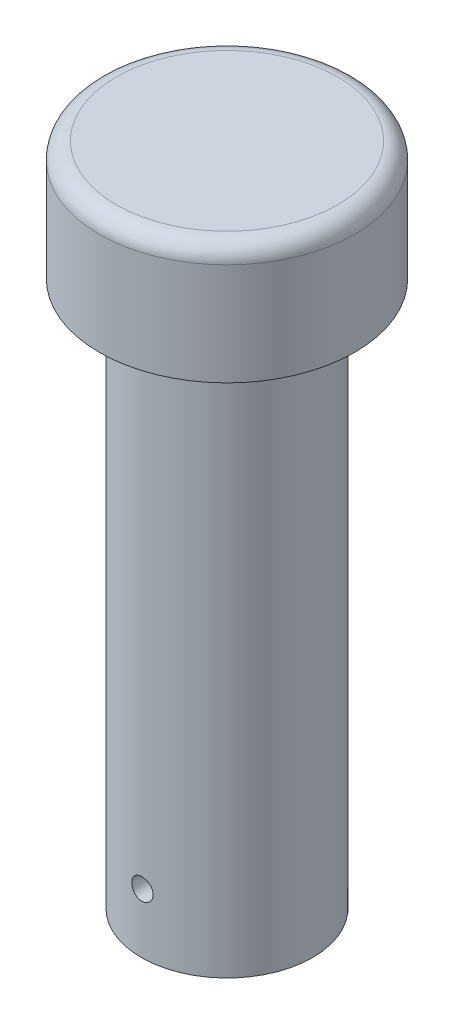
ISO-10303-21;
HEADER;
FILE_DESCRIPTION(('STEP AP214'),'2;1');
FILE_NAME('part.step','',(''),(''),'','','');
FILE_SCHEMA(('AUTOMOTIVE_DESIGN { 1 0 10303 214 1 1 1 1 }'));
ENDSEC;
DATA;
#1=APPLICATION_CONTEXT('core data for automotive mechanical design processes');
#2=APPLICATION_PROTOCOL_DEFINITION('international standard','automotive_design',2000,#1);
#3=PRODUCT_CONTEXT('',#1,'mechanical');
#4=PRODUCT('Part','Part','',(#3));
#5=PRODUCT_RELATED_PRODUCT_CATEGORY('part','',(#4));
#6=PRODUCT_DEFINITION_FORMATION('','',#4);
#7=PRODUCT_DEFINITION_CONTEXT('part definition',#1,'design');
#8=PRODUCT_DEFINITION('design','',#6,#7);
#9=PRODUCT_DEFINITION_SHAPE('','',#8);
#10=(LENGTH_UNIT() NAMED_UNIT(*) SI_UNIT(.MILLI.,.METRE.));
#11=(NAMED_UNIT(*) PLANE_ANGLE_UNIT() SI_UNIT($,.RADIAN.));
#12=(NAMED_UNIT(*) SI_UNIT($,.STERADIAN.) SOLID_ANGLE_UNIT());
#13=UNCERTAINTY_MEASURE_WITH_UNIT(LENGTH_MEASURE(1.E-05),#10,'distance_accuracy_value','');
#14=(GEOMETRIC_REPRESENTATION_CONTEXT(3) GLOBAL_UNCERTAINTY_ASSIGNED_CONTEXT((#13)) GLOBAL_UNIT_ASSIGNED_CONTEXT((#10,
#11,#12)) REPRESENTATION_CONTEXT('',''));
#15=CARTESIAN_POINT('',(0.,0.,0.));
#16=DIRECTION('',(0.,0.,1.));
#17=DIRECTION('',(1.,0.,0.));
#18=AXIS2_PLACEMENT_3D('',#15,#16,#17);
#19=CARTESIAN_POINT('',(0.,0.,0.));
#20=DIRECTION('',(0.,-1.,0.));
#21=DIRECTION('',(1.,0.,0.));
#22=AXIS2_PLACEMENT_3D('',#19,#20,#21);
#23=CYLINDRICAL_SURFACE('',#22,10.0490310034832);
#24=CARTESIAN_POINT('',(0.,0.,0.));
#25=DIRECTION('',(0.,-1.,0.));
#26=DIRECTION('',(1.,0.,0.));
#27=AXIS2_PLACEMENT_3D('',#24,#25,#26);
#28=CIRCLE('',#27,10.0490310034832);
#29=CARTESIAN_POINT('',(10.0490310034833,0.,0.));
#30=VERTEX_POINT('',#29);
#31=EDGE_CURVE('E71',#30,#30,#28,.T.);
#32=ORIENTED_EDGE('',*,*,#31,.F.);
#33=EDGE_LOOP('',(#32));
#34=FACE_BOUND('',#33,.T.);
#35=CARTESIAN_POINT('',(0.,64.,0.));
#36=DIRECTION('',(0.,-1.,0.));
#37=DIRECTION('',(1.,0.,0.));
#38=AXIS2_PLACEMENT_3D('',#35,#36,#37);
#39=CIRCLE('',#38,10.0490310034832);
#40=CARTESIAN_POINT('',(10.0490310034833,64.,0.));
#41=VERTEX_POINT('',#40);
#42=EDGE_CURVE('E112',#41,#41,#39,.T.);
#43=ORIENTED_EDGE('',*,*,#42,.T.);
#44=EDGE_LOOP('',(#43));
#45=FACE_BOUND('',#44,.T.);
#46=CARTESIAN_POINT('',(-1.20096899651696,7.00000000000001,-9.97700844834584));
#47=CARTESIAN_POINT('',(-1.20096602661466,7.06994777047504,-9.97700943290286));
#48=CARTESIAN_POINT('',(-1.19507802089044,7.13993930959228,-9.97772302440675));
#49=CARTESIAN_POINT('',(-1.17168191921586,7.27797549624546,-9.98049693275863));
#50=CARTESIAN_POINT('',(-1.15416166700574,7.34601802929543,-9.98255865843786));
#51=CARTESIAN_POINT('',(-1.10802336863928,7.47813844991756,-9.98778473632166));
#52=CARTESIAN_POINT('',(-1.07941263875882,7.54221891897629,-9.99094836147498));
#53=CARTESIAN_POINT('',(-1.01192016876901,7.66465735722281,-9.99800917829101));
#54=CARTESIAN_POINT('',(-0.973040214008706,7.72301631870349,-10.0019062424084));
#55=CARTESIAN_POINT('',(-0.885897088444158,7.83266803343691,-10.0100014260444));
#56=CARTESIAN_POINT('',(-0.837591548068009,7.88392702242294,-10.0142008488221));
#57=CARTESIAN_POINT('',(-0.733058930355346,7.97763109945409,-10.0223945085178));
#58=CARTESIAN_POINT('',(-0.676831484390437,8.02007577711717,-10.0263887358756));
#59=CARTESIAN_POINT('',(-0.557856950722236,8.09505454857212,-10.0337119842322));
#60=CARTESIAN_POINT('',(-0.495092313491918,8.12756099256419,-10.0370391406464));
#61=CARTESIAN_POINT('',(-0.364946921397817,8.18156048765048,-10.0426129716716));
#62=CARTESIAN_POINT('',(-0.297566341022408,8.20305395478874,-10.0448596870988));
#63=CARTESIAN_POINT('',(-0.160479323844041,8.23431027622814,-10.0479820919894));
#64=CARTESIAN_POINT('',(-0.0907869820064461,8.24413422637568,-10.0488649294235));
#65=CARTESIAN_POINT('',(0.0492600957614257,8.25196571972337,-10.0491541757943));
#66=CARTESIAN_POINT('',(0.119614807458572,8.24997369355249,-10.0485606385374));
#67=CARTESIAN_POINT('',(0.258612809320182,8.23427817663848,-10.0459421025385));
#68=CARTESIAN_POINT('',(0.327262985257314,8.22063431814498,-10.0439244015494));
#69=CARTESIAN_POINT('',(0.461287917617957,8.18211932812042,-10.0386621826073));
#70=CARTESIAN_POINT('',(0.526662601466092,8.15724794794225,-10.0354176374846));
#71=CARTESIAN_POINT('',(0.652519463261043,8.09689922372657,-10.0280224006302));
#72=CARTESIAN_POINT('',(0.712985299435614,8.0613881631936,-10.0238688397334));
#73=CARTESIAN_POINT('',(0.827122618755533,7.98079292328371,-10.0150973022249));
#74=CARTESIAN_POINT('',(0.880793782959897,7.93570829479055,-10.0104793038307));
#75=CARTESIAN_POINT('',(0.980207303259671,7.83687344723716,-10.0012365543212));
#76=CARTESIAN_POINT('',(1.02589227114185,7.78306546691293,-9.99661197729174));
#77=CARTESIAN_POINT('',(1.10758900054958,7.66850899441756,-9.98789087125032));
#78=CARTESIAN_POINT('',(1.14360075230733,7.60776049523812,-9.98379434277154));
#79=CARTESIAN_POINT('',(1.20491715526069,7.48102242134106,-9.97658040506178));
#80=CARTESIAN_POINT('',(1.23022153950048,7.41503271599854,-9.97346302024327));
#81=CARTESIAN_POINT('',(1.26937302783663,7.27969123028548,-9.96855602105133));
#82=CARTESIAN_POINT('',(1.28322072314337,7.21033962359787,-9.96676633816374));
#83=CARTESIAN_POINT('',(1.29898517912394,7.07078199871088,-9.96472405021067));
#84=CARTESIAN_POINT('',(1.30098780640956,7.00058583538987,-9.96446038313645));
#85=CARTESIAN_POINT('',(1.29323173743294,6.86085893697435,-9.965469907875));
#86=CARTESIAN_POINT('',(1.28347330841755,6.79132818679582,-9.96674306476648));
#87=CARTESIAN_POINT('',(1.2525431064141,6.65515725708869,-9.97067695900321));
#88=CARTESIAN_POINT('',(1.23141194063645,6.58850769921412,-9.97333275842384));
#89=CARTESIAN_POINT('',(1.17837839990771,6.45969814669192,-9.97973735513003));
#90=CARTESIAN_POINT('',(1.14647563251258,6.39753831571964,-9.98348619223779));
#91=CARTESIAN_POINT('',(1.07259808714457,6.27909118971406,-9.99169361289866));
#92=CARTESIAN_POINT('',(1.03056807566541,6.2228386157773,-9.9961560418319));
#93=CARTESIAN_POINT('',(0.937708288920097,6.11815618333013,-10.0052935204144));
#94=CARTESIAN_POINT('',(0.8868781438223,6.06972665375392,-10.0099685789935));
#95=CARTESIAN_POINT('',(0.777482049760646,5.98175848214614,-10.019060394613));
#96=CARTESIAN_POINT('',(0.718869917269498,5.94227705968786,-10.0234753626608));
#97=CARTESIAN_POINT('',(0.595798134518134,5.87371979660667,-10.0315425717925));
#98=CARTESIAN_POINT('',(0.531338588128609,5.84464377119256,-10.0351948264211));
#99=CARTESIAN_POINT('',(0.398553223849828,5.7978025804185,-10.0413436625032));
#100=CARTESIAN_POINT('',(0.330237041247274,5.78001047674363,-10.0438429924324));
#101=CARTESIAN_POINT('',(0.19155116718208,5.75615996213784,-10.0474445099136));
#102=CARTESIAN_POINT('',(0.121181570534403,5.7501010103043,-10.0485467618706));
#103=CARTESIAN_POINT('',(-0.0190856960246203,5.74990219602383,-10.0492559315308));
#104=CARTESIAN_POINT('',(-0.0889832080665156,5.75567889248741,-10.0488733006233));
#105=CARTESIAN_POINT('',(-0.226810884618131,5.77881443974995,-10.0467075699833));
#106=CARTESIAN_POINT('',(-0.294741056887878,5.79617324485765,-10.0449244757756));
#107=CARTESIAN_POINT('',(-0.426654340961013,5.84194412362637,-10.0401865548437));
#108=CARTESIAN_POINT('',(-0.490640960911992,5.87034620393601,-10.0372327874462));
#109=CARTESIAN_POINT('',(-0.612954145199407,5.93739008414521,-10.0305068530772));
#110=CARTESIAN_POINT('',(-0.671280658647044,5.97603197609706,-10.0267346787487));
#111=CARTESIAN_POINT('',(-0.781006459666883,6.06273938467569,-10.0187874830819));
#112=CARTESIAN_POINT('',(-0.832360912447587,6.11086142584252,-10.0146101256813));
#113=CARTESIAN_POINT('',(-0.926298634227643,6.21504626121868,-10.0063592074469));
#114=CARTESIAN_POINT('',(-0.968879817374801,6.27111093846184,-10.0022856714979));
#115=CARTESIAN_POINT('',(-1.04421043940365,6.38984604047404,-9.99470320469237));
#116=CARTESIAN_POINT('',(-1.07691962941726,6.45254213678013,-9.9911966115581));
#117=CARTESIAN_POINT('',(-1.13130077905499,6.58254261441208,-9.98518592103724));
#118=CARTESIAN_POINT('',(-1.15298469954334,6.64984191156844,-9.98268073789571));
#119=CARTESIAN_POINT('',(-1.17951279567661,6.76457380151842,-9.97957327603358));
#120=CARTESIAN_POINT('',(-1.18754735420265,6.81128429879012,-9.97861638317947));
#121=CARTESIAN_POINT('',(-1.19827644135072,6.90532318182883,-9.97733363828725));
#122=CARTESIAN_POINT('',(-1.20097100687741,6.95265156332336,-9.97700778188806));
#123=CARTESIAN_POINT('',(-1.20096899651696,7.00000000000001,-9.97700844834584));
#124=B_SPLINE_CURVE_WITH_KNOTS('',3,(#46,#47,#48,#49,#50,#51,#52,#53,#54,#55,#56,#57,#58,#59,
#60,#61,#62,#63,#64,#65,#66,#67,#68,#69,#70,#71,#72,#73,#74,#75,#76,#77,#78,#79,#80,#81,#82,#83,
#84,#85,#86,#87,#88,#89,#90,#91,#92,#93,#94,#95,#96,#97,#98,#99,#100,#101,#102,#103,#104,#105,
#106,#107,#108,#109,#110,#111,#112,#113,#114,#115,#116,#117,#118,#119,#120,#121,#122,#123),
.UNSPECIFIED.,.T.,.F.,(4,2,2,2,2,2,2,2,2,2,2,2,2,2,2,2,2,2,2,2,2,2,2,2,2,2,2,2,2,2,2,2,2,2,2,2,
2,2,4),(0.,0.209670413164504,0.419560287666007,0.629311934937426,0.839027139955425,
1.04970771986977,1.26039810657987,1.47166944344655,1.68293279839688,1.89308513772612,
2.10322981817645,2.31230541237919,2.52138563704207,2.73113556075312,2.94089532644952,
3.15210543817618,3.36331576317737,3.57453135375878,3.78573604410189,3.99540778622591,
4.20507476406223,4.41399802927191,4.62292890704834,4.83302615725208,5.04313223908086,
5.25454616761637,5.46595634143011,5.67685989293033,5.88775372146789,6.09716586938782,
6.30657719118451,6.51579945054036,6.72502359079424,6.93553517922943,7.14609675936418,
7.35750556541796,7.56868453071477,7.71061378483293,7.85254205807544),.UNSPECIFIED.);
#125=CARTESIAN_POINT('',(-1.20096899651696,7.00000000000001,-9.97700844834584));
#126=VERTEX_POINT('',#125);
#127=EDGE_CURVE('E74',#126,#126,#124,.T.);
#128=ORIENTED_EDGE('',*,*,#127,.F.);
#129=EDGE_LOOP('',(#128));
#130=FACE_BOUND('',#129,.T.);
#131=CARTESIAN_POINT('',(-1.2009689965168,7.00000000000001,9.97700844834629));
#132=CARTESIAN_POINT('',(-1.20096602661445,6.93005222952495,9.9770094329034));
#133=CARTESIAN_POINT('',(-1.19507802089036,6.8600606904077,9.97772302440682));
#134=CARTESIAN_POINT('',(-1.17168191921592,6.72202450375451,9.98049693275856));
#135=CARTESIAN_POINT('',(-1.15416166700582,6.65398197070455,9.9825586584381));
#136=CARTESIAN_POINT('',(-1.10802336863933,6.52186155008243,9.98778473632192));
#137=CARTESIAN_POINT('',(-1.07941263875883,6.45778108102371,9.99094836147495));
#138=CARTESIAN_POINT('',(-1.01192016876899,6.3353426427772,9.99800917829104));
#139=CARTESIAN_POINT('',(-0.973040214008698,6.27698368129653,10.0019062424088));
#140=CARTESIAN_POINT('',(-0.885897088444146,6.16733196656311,10.0100014260447));
#141=CARTESIAN_POINT('',(-0.837591548067983,6.11607297757706,10.0142008488221));
#142=CARTESIAN_POINT('',(-0.733058930355338,6.0223689005459,10.0223945085178));
#143=CARTESIAN_POINT('',(-0.676831484390462,5.97992422288283,10.026388735876));
#144=CARTESIAN_POINT('',(-0.557856950722269,5.9049454514279,10.0337119842327));
#145=CARTESIAN_POINT('',(-0.495092313491925,5.87243900743582,10.0370391406465));
#146=CARTESIAN_POINT('',(-0.3649469213978,5.81843951234953,10.0426129716715));
#147=CARTESIAN_POINT('',(-0.297566341022393,5.79694604521127,10.044859687099));
#148=CARTESIAN_POINT('',(-0.160479323844027,5.76568972377188,10.0479820919896));
#149=CARTESIAN_POINT('',(-0.0907869820064323,5.75586577362433,10.0488649294236));
#150=CARTESIAN_POINT('',(0.0492600957614322,5.74803428027665,10.0491541757942));
#151=CARTESIAN_POINT('',(0.119614807458572,5.75002630644752,10.0485606385374));
#152=CARTESIAN_POINT('',(0.258612809320167,5.76572182336153,10.0459421025385));
#153=CARTESIAN_POINT('',(0.327262985257292,5.77936568185503,10.0439244015494));
#154=CARTESIAN_POINT('',(0.461287917617927,5.81788067187958,10.0386621826073));
#155=CARTESIAN_POINT('',(0.526662601466062,5.84275205205773,10.0354176374846));
#156=CARTESIAN_POINT('',(0.652519463261018,5.90310077627342,10.0280224006302));
#157=CARTESIAN_POINT('',(0.712985299435594,5.9386118368064,10.0238688397334));
#158=CARTESIAN_POINT('',(0.827122618755534,6.0192070767163,10.0150973022249));
#159=CARTESIAN_POINT('',(0.880793782959916,6.06429170520946,10.0104793038307));
#160=CARTESIAN_POINT('',(0.980207303259692,6.16312655276285,10.0012365543212));
#161=CARTESIAN_POINT('',(1.02589227114186,6.21693453308707,9.9966119772917));
#162=CARTESIAN_POINT('',(1.10758900054955,6.33149100558245,9.98789087125037));
#163=CARTESIAN_POINT('',(1.14360075230729,6.3922395047619,9.98379434277174));
#164=CARTESIAN_POINT('',(1.20491715526065,6.51897757865896,9.97658040506196));
#165=CARTESIAN_POINT('',(1.23022153950046,6.58496728400147,9.97346302024329));
#166=CARTESIAN_POINT('',(1.26937302783665,6.72030876971452,9.96855602105131));
#167=CARTESIAN_POINT('',(1.28322072314341,6.78966037640214,9.96676633816384));
#168=CARTESIAN_POINT('',(1.29898517912397,6.92921800128913,9.96472405021079));
#169=CARTESIAN_POINT('',(1.30098780640957,6.99941416461013,9.96446038313647));
#170=CARTESIAN_POINT('',(1.29323173743293,7.13914106302564,9.96546990787499));
#171=CARTESIAN_POINT('',(1.28347330841754,7.20867181320416,9.96674306476653));
#172=CARTESIAN_POINT('',(1.2525431064141,7.3448427429113,9.97067695900327));
#173=CARTESIAN_POINT('',(1.23141194063646,7.41149230078587,9.97333275842382));
#174=CARTESIAN_POINT('',(1.17837839990772,7.54030185330807,9.97973735513005));
#175=CARTESIAN_POINT('',(1.1464756325126,7.60246168428034,9.98348619223791));
#176=CARTESIAN_POINT('',(1.07259808714459,7.72090881028592,9.99169361289877));
#177=CARTESIAN_POINT('',(1.03056807566542,7.77716138422269,9.9961560418319));
#178=CARTESIAN_POINT('',(0.937708288920113,7.88184381666988,10.0052935204144));
#179=CARTESIAN_POINT('',(0.886878143822328,7.93027334624609,10.0099685789936));
#180=CARTESIAN_POINT('',(0.777482049760674,8.01824151785387,10.0190603946131));
#181=CARTESIAN_POINT('',(0.718869917269514,8.05772294031214,10.0234753626608));
#182=CARTESIAN_POINT('',(0.595798134518143,8.12628020339334,10.0315425717925));
#183=CARTESIAN_POINT('',(0.531338588128623,8.15535622880745,10.0351948264212));
#184=CARTESIAN_POINT('',(0.398553223849846,8.20219741958151,10.0413436625033));
#185=CARTESIAN_POINT('',(0.33023704124729,8.21998952325638,10.0438429924324));
#186=CARTESIAN_POINT('',(0.191551167182099,8.24384003786217,10.0474445099137));
#187=CARTESIAN_POINT('',(0.121181570534427,8.24989898969571,10.0485467618708));
#188=CARTESIAN_POINT('',(-0.0190856960245974,8.25009780397619,10.049255931531));
#189=CARTESIAN_POINT('',(-0.088983208066498,8.24432110751261,10.0488733006233));
#190=CARTESIAN_POINT('',(-0.22681088461813,8.22118556025006,10.0467075699833));
#191=CARTESIAN_POINT('',(-0.294741056887888,8.20382675514235,10.0449244757759));
#192=CARTESIAN_POINT('',(-0.426654340961012,8.15805587637365,10.0401865548439));
#193=CARTESIAN_POINT('',(-0.490640960911969,8.12965379606404,10.037232787446));
#194=CARTESIAN_POINT('',(-0.612954145199358,8.06260991585481,10.0305068530774));
#195=CARTESIAN_POINT('',(-0.671280658646991,8.02396802390291,10.0267346787496));
#196=CARTESIAN_POINT('',(-0.781006459666832,7.93726061532429,10.0187874830827));
#197=CARTESIAN_POINT('',(-0.832360912447539,7.88913857415751,10.0146101256814));
#198=CARTESIAN_POINT('',(-0.926298634227645,7.78495373878137,10.0063592074467));
#199=CARTESIAN_POINT('',(-0.968879817374849,7.72888906153819,10.0022856714983));
#200=CARTESIAN_POINT('',(-1.04421043940371,7.61015395952597,9.99470320469285));
#201=CARTESIAN_POINT('',(-1.07691962941727,7.54745786321988,9.99119661155816));
#202=CARTESIAN_POINT('',(-1.13130077905497,7.41745738558793,9.98518592103718));
#203=CARTESIAN_POINT('',(-1.15298469954333,7.35015808843157,9.98268073789596));
#204=CARTESIAN_POINT('',(-1.17951279567663,7.2354261984816,9.97957327603374));
#205=CARTESIAN_POINT('',(-1.18754735420269,7.1887157012099,9.97861638317941));
#206=CARTESIAN_POINT('',(-1.19827644135068,7.0946768181712,9.97733363828731));
#207=CARTESIAN_POINT('',(-1.20097100687727,7.04734843667666,9.97700778188844));
#208=CARTESIAN_POINT('',(-1.2009689965168,7.00000000000001,9.97700844834629));
#209=B_SPLINE_CURVE_WITH_KNOTS('',3,(#131,#132,#133,#134,#135,#136,#137,#138,#139,#140,#141,
#142,#143,#144,#145,#146,#147,#148,#149,#150,#151,#152,#153,#154,#155,#156,#157,#158,#159,#160,
#161,#162,#163,#164,#165,#166,#167,#168,#169,#170,#171,#172,#173,#174,#175,#176,#177,#178,#179,
#180,#181,#182,#183,#184,#185,#186,#187,#188,#189,#190,#191,#192,#193,#194,#195,#196,#197,#198,
#199,#200,#201,#202,#203,#204,#205,#206,#207,#208),.UNSPECIFIED.,.T.,.F.,(4,2,2,2,2,2,2,2,2,2,2,
2,2,2,2,2,2,2,2,2,2,2,2,2,2,2,2,2,2,2,2,2,2,2,2,2,2,2,4),(0.,0.209670413164528,
0.419560287666007,0.629311934937417,0.839027139955443,1.04970771986978,1.26039810657985,
1.47166944344655,1.6829327983969,1.89308513772613,2.10322981817644,2.31230541237916,
2.52138563704202,2.73113556075311,2.94089532644954,3.15210543817617,3.36331576317734,
3.57453135375877,3.78573604410188,3.99540778622589,4.2050747640622,4.41399802927188,
4.62292890704831,4.83302615725205,5.04313223908084,5.25454616761635,5.4659563414301,
5.67685989293031,5.88775372146787,6.09716586938782,6.30657719118452,6.51579945054032,
6.72502359079416,6.93553517922939,7.14609675936419,7.35750556541797,7.56868453071477,
7.71061378483291,7.85254205807543),.UNSPECIFIED.);
#210=CARTESIAN_POINT('',(-1.2009689965168,7.00000000000001,9.97700844834629));
#211=VERTEX_POINT('',#210);
#212=EDGE_CURVE('E57',#211,#211,#209,.T.);
#213=ORIENTED_EDGE('',*,*,#212,.F.);
#214=EDGE_LOOP('',(#213));
#215=FACE_BOUND('',#214,.T.);
#216=ADVANCED_FACE('F53',(#34,#45,#130,#215),#23,.T.);
#217=CARTESIAN_POINT('',(0.,78.,0.));
#218=DIRECTION('',(0.,-1.,0.));
#219=DIRECTION('',(1.,0.,0.));
#220=AXIS2_PLACEMENT_3D('',#217,#218,#219);
#221=PLANE('',#220);
#222=CARTESIAN_POINT('',(0.,78.,0.));
#223=DIRECTION('',(0.,-1.,0.));
#224=DIRECTION('',(1.,0.,0.));
#225=AXIS2_PLACEMENT_3D('',#222,#223,#224);
#226=CIRCLE('',#225,13.);
#227=CARTESIAN_POINT('',(13.0000000000001,78.,0.));
#228=VERTEX_POINT('',#227);
#229=EDGE_CURVE('E12',#228,#228,#226,.F.);
#230=ORIENTED_EDGE('',*,*,#229,.T.);
#231=EDGE_LOOP('',(#230));
#232=FACE_BOUND('',#231,.T.);
#233=ADVANCED_FACE('F86',(#232),#221,.F.);
#234=CARTESIAN_POINT('',(0.,0.,0.));
#235=DIRECTION('',(0.,-1.,0.));
#236=DIRECTION('',(1.,0.,0.));
#237=AXIS2_PLACEMENT_3D('',#234,#235,#236);
#238=CYLINDRICAL_SURFACE('',#237,15.);
#239=CARTESIAN_POINT('',(0.,76.,0.));
#240=DIRECTION('',(0.,-1.,0.));
#241=DIRECTION('',(1.,0.,0.));
#242=AXIS2_PLACEMENT_3D('',#239,#240,#241);
#243=CIRCLE('',#242,15.);
#244=CARTESIAN_POINT('',(15.0000000000001,76.,0.));
#245=VERTEX_POINT('',#244);
#246=EDGE_CURVE('E66',#245,#245,#243,.T.);
#247=ORIENTED_EDGE('',*,*,#246,.T.);
#248=EDGE_LOOP('',(#247));
#249=FACE_BOUND('',#248,.T.);
#250=CARTESIAN_POINT('',(0.,64.,0.));
#251=DIRECTION('',(0.,-1.,0.));
#252=DIRECTION('',(1.,0.,0.));
#253=AXIS2_PLACEMENT_3D('',#250,#251,#252);
#254=CIRCLE('',#253,15.);
#255=CARTESIAN_POINT('',(15.0000000000001,64.,0.));
#256=VERTEX_POINT('',#255);
#257=EDGE_CURVE('E118',#256,#256,#254,.T.);
#258=ORIENTED_EDGE('',*,*,#257,.F.);
#259=EDGE_LOOP('',(#258));
#260=FACE_BOUND('',#259,.T.);
#261=ADVANCED_FACE('F90',(#249,#260),#238,.T.);
#262=CARTESIAN_POINT('',(0.,64.,0.));
#263=DIRECTION('',(0.,1.,0.));
#264=DIRECTION('',(-1.,0.,0.));
#265=AXIS2_PLACEMENT_3D('',#262,#263,#264);
#266=PLANE('',#265);
#267=ORIENTED_EDGE('',*,*,#42,.F.);
#268=EDGE_LOOP('',(#267));
#269=FACE_BOUND('',#268,.T.);
#270=ORIENTED_EDGE('',*,*,#257,.T.);
#271=EDGE_LOOP('',(#270));
#272=FACE_BOUND('',#271,.T.);
#273=ADVANCED_FACE('F91',(#269,#272),#266,.F.);
#274=CARTESIAN_POINT('',(0.,0.,0.));
#275=DIRECTION('',(0.,-1.,0.));
#276=DIRECTION('',(1.,0.,0.));
#277=AXIS2_PLACEMENT_3D('',#274,#275,#276);
#278=PLANE('',#277);
#279=ORIENTED_EDGE('',*,*,#31,.T.);
#280=EDGE_LOOP('',(#279));
#281=FACE_BOUND('',#280,.T.);
#282=ADVANCED_FACE('F95',(#281),#278,.T.);
#283=CARTESIAN_POINT('',(0.,76.,0.));
#284=DIRECTION('',(0.,-1.,0.));
#285=DIRECTION('',(1.,0.,0.));
#286=AXIS2_PLACEMENT_3D('',#283,#284,#285);
#287=TOROIDAL_SURFACE('',#286,13.,2.);
#288=ORIENTED_EDGE('',*,*,#229,.F.);
#289=EDGE_LOOP('',(#288));
#290=FACE_BOUND('',#289,.T.);
#291=ORIENTED_EDGE('',*,*,#246,.F.);
#292=EDGE_LOOP('',(#291));
#293=FACE_BOUND('',#292,.T.);
#294=ADVANCED_FACE('F55',(#290,#293),#287,.T.);
#295=CARTESIAN_POINT('',(0.0490310034832117,7.00000000000001,15.));
#296=DIRECTION('',(0.,0.,-1.));
#297=DIRECTION('',(-1.,0.,0.));
#298=AXIS2_PLACEMENT_3D('',#295,#296,#297);
#299=CYLINDRICAL_SURFACE('',#298,1.25);
#300=ORIENTED_EDGE('',*,*,#127,.T.);
#301=EDGE_LOOP('',(#300));
#302=FACE_BOUND('',#301,.T.);
#303=ORIENTED_EDGE('',*,*,#212,.T.);
#304=EDGE_LOOP('',(#303));
#305=FACE_BOUND('',#304,.T.);
#306=ADVANCED_FACE('F81',(#302,#305),#299,.F.);
#307=CLOSED_SHELL('',(#216,#233,#261,#273,#282,#294,#306));
#308=MANIFOLD_SOLID_BREP('B2',#307);
#309=ADVANCED_BREP_SHAPE_REPRESENTATION('',(#18,#308),#14);
#310=SHAPE_DEFINITION_REPRESENTATION(#9,#309);
ENDSEC;
END-ISO-10303-21;
